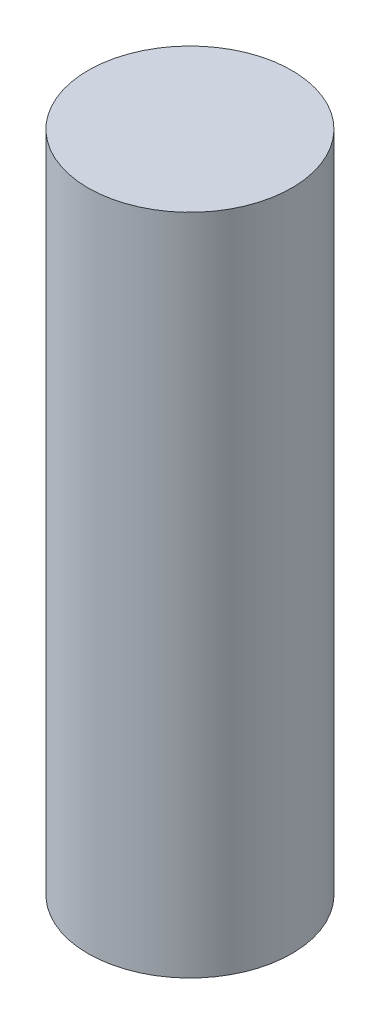
ISO-10303-21;
HEADER;
FILE_DESCRIPTION(('STEP AP214'),'2;1');
FILE_NAME('part.step','',(''),(''),'','','');
FILE_SCHEMA(('AUTOMOTIVE_DESIGN { 1 0 10303 214 1 1 1 1 }'));
ENDSEC;
DATA;
#1=APPLICATION_CONTEXT('core data for automotive mechanical design processes');
#2=APPLICATION_PROTOCOL_DEFINITION('international standard','automotive_design',2000,#1);
#3=PRODUCT_CONTEXT('',#1,'mechanical');
#4=PRODUCT('Part','Part','',(#3));
#5=PRODUCT_RELATED_PRODUCT_CATEGORY('part','',(#4));
#6=PRODUCT_DEFINITION_FORMATION('','',#4);
#7=PRODUCT_DEFINITION_CONTEXT('part definition',#1,'design');
#8=PRODUCT_DEFINITION('design','',#6,#7);
#9=PRODUCT_DEFINITION_SHAPE('','',#8);
#10=(LENGTH_UNIT() NAMED_UNIT(*) SI_UNIT(.MILLI.,.METRE.));
#11=(NAMED_UNIT(*) PLANE_ANGLE_UNIT() SI_UNIT($,.RADIAN.));
#12=(NAMED_UNIT(*) SI_UNIT($,.STERADIAN.) SOLID_ANGLE_UNIT());
#13=UNCERTAINTY_MEASURE_WITH_UNIT(LENGTH_MEASURE(1.E-05),#10,'distance_accuracy_value','');
#14=(GEOMETRIC_REPRESENTATION_CONTEXT(3) GLOBAL_UNCERTAINTY_ASSIGNED_CONTEXT((#13)) GLOBAL_UNIT_ASSIGNED_CONTEXT((#10,
#11,#12)) REPRESENTATION_CONTEXT('',''));
#15=CARTESIAN_POINT('',(0.,0.,0.));
#16=DIRECTION('',(0.,0.,1.));
#17=DIRECTION('',(1.,0.,0.));
#18=AXIS2_PLACEMENT_3D('',#15,#16,#17);
#19=CARTESIAN_POINT('',(0.,70.15,0.));
#20=DIRECTION('',(0.,-1.,0.));
#21=DIRECTION('',(0.,0.,-1.));
#22=AXIS2_PLACEMENT_3D('',#19,#20,#21);
#23=CYLINDRICAL_SURFACE('',#22,10.775);
#24=CARTESIAN_POINT('',(0.,70.15,0.));
#25=DIRECTION('',(0.,1.,0.));
#26=DIRECTION('',(0.,0.,1.));
#27=AXIS2_PLACEMENT_3D('',#24,#25,#26);
#28=CIRCLE('',#27,10.775);
#29=CARTESIAN_POINT('',(0.,70.15,10.775));
#30=VERTEX_POINT('',#29);
#31=EDGE_CURVE('E10',#30,#30,#28,.T.);
#32=ORIENTED_EDGE('',*,*,#31,.F.);
#33=EDGE_LOOP('',(#32));
#34=FACE_BOUND('',#33,.T.);
#35=CARTESIAN_POINT('',(0.,0.,0.));
#36=DIRECTION('',(0.,1.,0.));
#37=DIRECTION('',(0.,0.,1.));
#38=AXIS2_PLACEMENT_3D('',#35,#36,#37);
#39=CIRCLE('',#38,10.775);
#40=CARTESIAN_POINT('',(0.,0.,10.775));
#41=VERTEX_POINT('',#40);
#42=EDGE_CURVE('E44',#41,#41,#39,.T.);
#43=ORIENTED_EDGE('',*,*,#42,.T.);
#44=EDGE_LOOP('',(#43));
#45=FACE_BOUND('',#44,.T.);
#46=ADVANCED_FACE('F41',(#34,#45),#23,.T.);
#47=CARTESIAN_POINT('',(0.,70.15,0.));
#48=DIRECTION('',(0.,1.,0.));
#49=DIRECTION('',(0.,0.,1.));
#50=AXIS2_PLACEMENT_3D('',#47,#48,#49);
#51=PLANE('',#50);
#52=ORIENTED_EDGE('',*,*,#31,.T.);
#53=EDGE_LOOP('',(#52));
#54=FACE_BOUND('',#53,.T.);
#55=ADVANCED_FACE('F56',(#54),#51,.T.);
#56=CARTESIAN_POINT('',(0.,0.,0.));
#57=DIRECTION('',(0.,1.,0.));
#58=DIRECTION('',(0.,0.,1.));
#59=AXIS2_PLACEMENT_3D('',#56,#57,#58);
#60=PLANE('',#59);
#61=ORIENTED_EDGE('',*,*,#42,.F.);
#62=EDGE_LOOP('',(#61));
#63=FACE_BOUND('',#62,.T.);
#64=ADVANCED_FACE('F54',(#63),#60,.F.);
#65=CLOSED_SHELL('',(#46,#55,#64));
#66=MANIFOLD_SOLID_BREP('B2',#65);
#67=ADVANCED_BREP_SHAPE_REPRESENTATION('',(#18,#66),#14);
#68=SHAPE_DEFINITION_REPRESENTATION(#9,#67);
ENDSEC;
END-ISO-10303-21;
